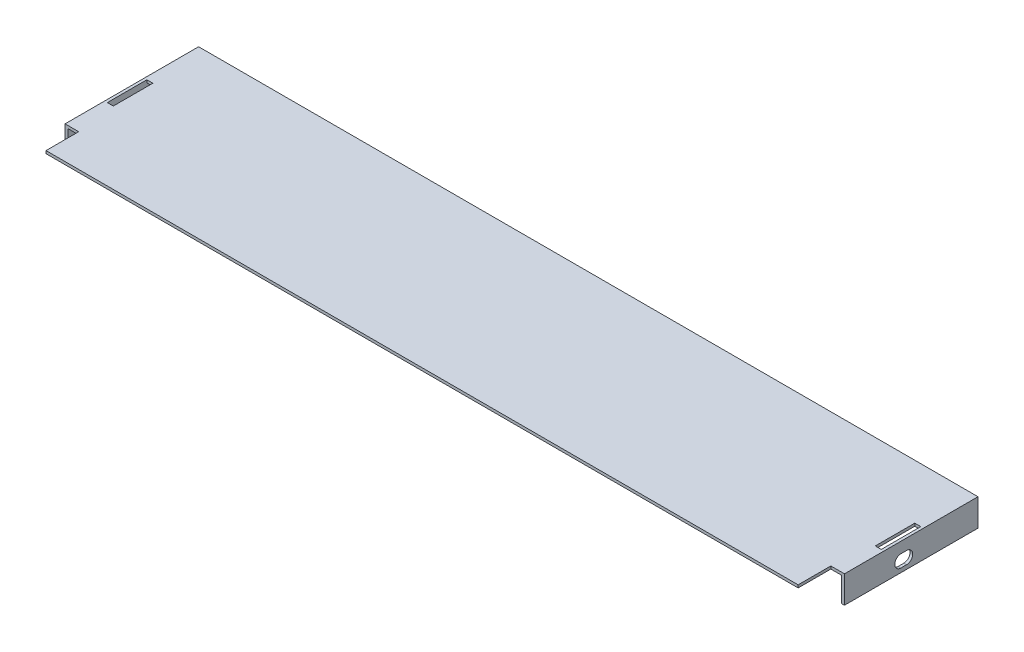
ISO-10303-21;
HEADER;
FILE_DESCRIPTION(('STEP AP214'),'2;1');
FILE_NAME('part.step','',(''),(''),'','','');
FILE_SCHEMA(('AUTOMOTIVE_DESIGN { 1 0 10303 214 1 1 1 1 }'));
ENDSEC;
DATA;
#1=APPLICATION_CONTEXT('core data for automotive mechanical design processes');
#2=APPLICATION_PROTOCOL_DEFINITION('international standard','automotive_design',2000,#1);
#3=PRODUCT_CONTEXT('',#1,'mechanical');
#4=PRODUCT('Part','Part','',(#3));
#5=PRODUCT_RELATED_PRODUCT_CATEGORY('part','',(#4));
#6=PRODUCT_DEFINITION_FORMATION('','',#4);
#7=PRODUCT_DEFINITION_CONTEXT('part definition',#1,'design');
#8=PRODUCT_DEFINITION('design','',#6,#7);
#9=PRODUCT_DEFINITION_SHAPE('','',#8);
#10=(LENGTH_UNIT() NAMED_UNIT(*) SI_UNIT(.MILLI.,.METRE.));
#11=(NAMED_UNIT(*) PLANE_ANGLE_UNIT() SI_UNIT($,.RADIAN.));
#12=(NAMED_UNIT(*) SI_UNIT($,.STERADIAN.) SOLID_ANGLE_UNIT());
#13=UNCERTAINTY_MEASURE_WITH_UNIT(LENGTH_MEASURE(1.E-05),#10,'distance_accuracy_value','');
#14=(GEOMETRIC_REPRESENTATION_CONTEXT(3) GLOBAL_UNCERTAINTY_ASSIGNED_CONTEXT((#13)) GLOBAL_UNIT_ASSIGNED_CONTEXT((#10,
#11,#12)) REPRESENTATION_CONTEXT('',''));
#15=CARTESIAN_POINT('',(0.,0.,0.));
#16=DIRECTION('',(0.,0.,1.));
#17=DIRECTION('',(1.,0.,0.));
#18=AXIS2_PLACEMENT_3D('',#15,#16,#17);
#19=CARTESIAN_POINT('',(143.,1.,18.5));
#20=DIRECTION('',(-1.,0.,0.));
#21=DIRECTION('',(0.,0.,1.));
#22=AXIS2_PLACEMENT_3D('',#19,#20,#21);
#23=PLANE('',#22);
#24=DIRECTION('',(0.,-1.,0.));
#25=VECTOR('',#24,1.);
#26=CARTESIAN_POINT('',(143.,1.,18.5));
#27=LINE('',#26,#25);
#28=CARTESIAN_POINT('',(143.,1.,18.5));
#29=VERTEX_POINT('',#28);
#30=CARTESIAN_POINT('',(143.,-9.,18.5));
#31=VERTEX_POINT('',#30);
#32=EDGE_CURVE('E393',#29,#31,#27,.T.);
#33=ORIENTED_EDGE('',*,*,#32,.T.);
#34=DIRECTION('',(0.,0.,1.));
#35=VECTOR('',#34,1.);
#36=CARTESIAN_POINT('',(143.,-9.,-30.5));
#37=LINE('',#36,#35);
#38=CARTESIAN_POINT('',(143.,-9.,-30.5));
#39=VERTEX_POINT('',#38);
#40=EDGE_CURVE('E286',#39,#31,#37,.T.);
#41=ORIENTED_EDGE('',*,*,#40,.F.);
#42=DIRECTION('',(0.,-1.,0.));
#43=VECTOR('',#42,1.);
#44=CARTESIAN_POINT('',(143.,1.,-30.5));
#45=LINE('',#44,#43);
#46=CARTESIAN_POINT('',(143.,1.,-30.5));
#47=VERTEX_POINT('',#46);
#48=EDGE_CURVE('E420',#47,#39,#45,.T.);
#49=ORIENTED_EDGE('',*,*,#48,.F.);
#50=DIRECTION('',(0.,0.,-1.));
#51=VECTOR('',#50,1.);
#52=CARTESIAN_POINT('',(143.,1.,18.5));
#53=LINE('',#52,#51);
#54=EDGE_CURVE('E375',#29,#47,#53,.T.);
#55=ORIENTED_EDGE('',*,*,#54,.F.);
#56=EDGE_LOOP('',(#33,#41,#49,#55));
#57=FACE_BOUND('',#56,.T.);
#58=CARTESIAN_POINT('',(143.,-5.25,-2.19999999999996));
#59=DIRECTION('',(-1.,0.,0.));
#60=DIRECTION('',(0.,0.,1.));
#61=AXIS2_PLACEMENT_3D('',#58,#59,#60);
#62=CIRCLE('',#61,2.25);
#63=CARTESIAN_POINT('',(143.,-7.5,-2.19999999999996));
#64=VERTEX_POINT('',#63);
#65=CARTESIAN_POINT('',(143.,-3.,-2.19999999999996));
#66=VERTEX_POINT('',#65);
#67=EDGE_CURVE('E49',#64,#66,#62,.T.);
#68=ORIENTED_EDGE('',*,*,#67,.T.);
#69=DIRECTION('',(0.,0.,-1.));
#70=VECTOR('',#69,1.);
#71=CARTESIAN_POINT('',(143.,-3.,-2.19999999999996));
#72=LINE('',#71,#70);
#73=CARTESIAN_POINT('',(143.,-3.,-4.29999999999996));
#74=VERTEX_POINT('',#73);
#75=EDGE_CURVE('E251',#66,#74,#72,.T.);
#76=ORIENTED_EDGE('',*,*,#75,.T.);
#77=CARTESIAN_POINT('',(143.,-5.25,-4.29999999999996));
#78=DIRECTION('',(-1.,0.,0.));
#79=DIRECTION('',(0.,0.,1.));
#80=AXIS2_PLACEMENT_3D('',#77,#78,#79);
#81=CIRCLE('',#80,2.25);
#82=CARTESIAN_POINT('',(143.,-7.5,-4.29999999999996));
#83=VERTEX_POINT('',#82);
#84=EDGE_CURVE('E254',#74,#83,#81,.T.);
#85=ORIENTED_EDGE('',*,*,#84,.T.);
#86=DIRECTION('',(0.,0.,-1.));
#87=VECTOR('',#86,1.);
#88=CARTESIAN_POINT('',(143.,-7.5,-2.19999999999996));
#89=LINE('',#88,#87);
#90=EDGE_CURVE('E231',#64,#83,#89,.T.);
#91=ORIENTED_EDGE('',*,*,#90,.F.);
#92=EDGE_LOOP('',(#68,#76,#85,#91));
#93=FACE_BOUND('',#92,.T.);
#94=ADVANCED_FACE('F35',(#57,#93),#23,.F.);
#95=CARTESIAN_POINT('',(-143.,1.,18.5));
#96=DIRECTION('',(1.,0.,0.));
#97=DIRECTION('',(0.,0.,-1.));
#98=AXIS2_PLACEMENT_3D('',#95,#96,#97);
#99=PLANE('',#98);
#100=DIRECTION('',(0.,-1.,0.));
#101=VECTOR('',#100,1.);
#102=CARTESIAN_POINT('',(-143.,1.,-30.5));
#103=LINE('',#102,#101);
#104=CARTESIAN_POINT('',(-143.,1.,-30.5));
#105=VERTEX_POINT('',#104);
#106=CARTESIAN_POINT('',(-143.,-9.,-30.5));
#107=VERTEX_POINT('',#106);
#108=EDGE_CURVE('E418',#105,#107,#103,.T.);
#109=ORIENTED_EDGE('',*,*,#108,.T.);
#110=DIRECTION('',(0.,0.,-1.));
#111=VECTOR('',#110,1.);
#112=CARTESIAN_POINT('',(-143.,-9.,18.5));
#113=LINE('',#112,#111);
#114=CARTESIAN_POINT('',(-143.,-9.,18.5));
#115=VERTEX_POINT('',#114);
#116=EDGE_CURVE('E279',#115,#107,#113,.T.);
#117=ORIENTED_EDGE('',*,*,#116,.F.);
#118=DIRECTION('',(0.,-1.,0.));
#119=VECTOR('',#118,1.);
#120=CARTESIAN_POINT('',(-143.,1.,18.5));
#121=LINE('',#120,#119);
#122=CARTESIAN_POINT('',(-143.,1.,18.5));
#123=VERTEX_POINT('',#122);
#124=EDGE_CURVE('E416',#123,#115,#121,.T.);
#125=ORIENTED_EDGE('',*,*,#124,.F.);
#126=DIRECTION('',(0.,0.,1.));
#127=VECTOR('',#126,1.);
#128=CARTESIAN_POINT('',(-143.,1.,18.5));
#129=LINE('',#128,#127);
#130=EDGE_CURVE('E381',#105,#123,#129,.T.);
#131=ORIENTED_EDGE('',*,*,#130,.F.);
#132=EDGE_LOOP('',(#109,#117,#125,#131));
#133=FACE_BOUND('',#132,.T.);
#134=CARTESIAN_POINT('',(-143.,-5.25,-2.19999999999996));
#135=DIRECTION('',(-1.,0.,0.));
#136=DIRECTION('',(0.,0.,1.));
#137=AXIS2_PLACEMENT_3D('',#134,#135,#136);
#138=CIRCLE('',#137,2.25);
#139=CARTESIAN_POINT('',(-143.,-7.5,-2.19999999999996));
#140=VERTEX_POINT('',#139);
#141=CARTESIAN_POINT('',(-143.,-3.,-2.19999999999996));
#142=VERTEX_POINT('',#141);
#143=EDGE_CURVE('E221',#140,#142,#138,.T.);
#144=ORIENTED_EDGE('',*,*,#143,.F.);
#145=DIRECTION('',(0.,0.,-1.));
#146=VECTOR('',#145,1.);
#147=CARTESIAN_POINT('',(-143.,-7.5,-2.19999999999996));
#148=LINE('',#147,#146);
#149=CARTESIAN_POINT('',(-143.,-7.5,-4.29999999999996));
#150=VERTEX_POINT('',#149);
#151=EDGE_CURVE('E245',#140,#150,#148,.T.);
#152=ORIENTED_EDGE('',*,*,#151,.T.);
#153=CARTESIAN_POINT('',(-143.,-5.25,-4.29999999999996));
#154=DIRECTION('',(-1.,0.,0.));
#155=DIRECTION('',(0.,0.,1.));
#156=AXIS2_PLACEMENT_3D('',#153,#154,#155);
#157=CIRCLE('',#156,2.25);
#158=CARTESIAN_POINT('',(-143.,-3.,-4.29999999999996));
#159=VERTEX_POINT('',#158);
#160=EDGE_CURVE('E243',#159,#150,#157,.T.);
#161=ORIENTED_EDGE('',*,*,#160,.F.);
#162=DIRECTION('',(0.,0.,-1.));
#163=VECTOR('',#162,1.);
#164=CARTESIAN_POINT('',(-143.,-3.,-2.19999999999996));
#165=LINE('',#164,#163);
#166=EDGE_CURVE('E230',#142,#159,#165,.T.);
#167=ORIENTED_EDGE('',*,*,#166,.F.);
#168=EDGE_LOOP('',(#144,#152,#161,#167));
#169=FACE_BOUND('',#168,.T.);
#170=ADVANCED_FACE('F242',(#133,#169),#99,.F.);
#171=CARTESIAN_POINT('',(142.,1.,-10.5));
#172=DIRECTION('',(-1.,0.,0.));
#173=DIRECTION('',(0.,0.,1.));
#174=AXIS2_PLACEMENT_3D('',#171,#172,#173);
#175=PLANE('',#174);
#176=DIRECTION('',(0.,-1.,0.));
#177=VECTOR('',#176,1.);
#178=CARTESIAN_POINT('',(142.,1.,-10.5));
#179=LINE('',#178,#177);
#180=CARTESIAN_POINT('',(142.,1.,-10.5));
#181=VERTEX_POINT('',#180);
#182=CARTESIAN_POINT('',(142.,0.,-10.5));
#183=VERTEX_POINT('',#182);
#184=EDGE_CURVE('E371',#181,#183,#179,.T.);
#185=ORIENTED_EDGE('',*,*,#184,.T.);
#186=DIRECTION('',(0.,0.,-1.));
#187=VECTOR('',#186,1.);
#188=CARTESIAN_POINT('',(142.,0.,18.5));
#189=LINE('',#188,#187);
#190=CARTESIAN_POINT('',(142.,0.,-29.5));
#191=VERTEX_POINT('',#190);
#192=EDGE_CURVE('E301',#183,#191,#189,.T.);
#193=ORIENTED_EDGE('',*,*,#192,.T.);
#194=DIRECTION('',(0.,1.,0.));
#195=VECTOR('',#194,1.);
#196=CARTESIAN_POINT('',(142.,-9.,-29.5));
#197=LINE('',#196,#195);
#198=CARTESIAN_POINT('',(142.,-9.,-29.5));
#199=VERTEX_POINT('',#198);
#200=EDGE_CURVE('E312',#199,#191,#197,.T.);
#201=ORIENTED_EDGE('',*,*,#200,.F.);
#202=DIRECTION('',(0.,0.,-1.));
#203=VECTOR('',#202,1.);
#204=CARTESIAN_POINT('',(142.,-9.,18.5));
#205=LINE('',#204,#203);
#206=CARTESIAN_POINT('',(142.,-9.,18.5));
#207=VERTEX_POINT('',#206);
#208=EDGE_CURVE('E291',#207,#199,#205,.T.);
#209=ORIENTED_EDGE('',*,*,#208,.F.);
#210=DIRECTION('',(0.,1.,0.));
#211=VECTOR('',#210,1.);
#212=CARTESIAN_POINT('',(142.,-9.,18.5));
#213=LINE('',#212,#211);
#214=CARTESIAN_POINT('',(142.,0.,18.5));
#215=VERTEX_POINT('',#214);
#216=EDGE_CURVE('E315',#207,#215,#213,.T.);
#217=ORIENTED_EDGE('',*,*,#216,.T.);
#218=CARTESIAN_POINT('',(142.,0.,4.00000000000004));
#219=VERTEX_POINT('',#218);
#220=EDGE_CURVE('E275',#215,#219,#189,.T.);
#221=ORIENTED_EDGE('',*,*,#220,.T.);
#222=DIRECTION('',(0.,-1.,0.));
#223=VECTOR('',#222,1.);
#224=CARTESIAN_POINT('',(142.,1.,4.00000000000004));
#225=LINE('',#224,#223);
#226=CARTESIAN_POINT('',(142.,1.,4.00000000000004));
#227=VERTEX_POINT('',#226);
#228=EDGE_CURVE('E358',#227,#219,#225,.T.);
#229=ORIENTED_EDGE('',*,*,#228,.F.);
#230=DIRECTION('',(0.,0.,-1.));
#231=VECTOR('',#230,1.);
#232=CARTESIAN_POINT('',(142.,1.,-10.5));
#233=LINE('',#232,#231);
#234=EDGE_CURVE('E348',#227,#181,#233,.T.);
#235=ORIENTED_EDGE('',*,*,#234,.T.);
#236=EDGE_LOOP('',(#185,#193,#201,#209,#217,#221,#229,#235));
#237=FACE_BOUND('',#236,.T.);
#238=DIRECTION('',(0.,0.,1.));
#239=VECTOR('',#238,1.);
#240=CARTESIAN_POINT('',(142.,-3.,-10.5));
#241=LINE('',#240,#239);
#242=CARTESIAN_POINT('',(142.,-3.,-4.29999999999996));
#243=VERTEX_POINT('',#242);
#244=CARTESIAN_POINT('',(142.,-3.,-2.19999999999996));
#245=VERTEX_POINT('',#244);
#246=EDGE_CURVE('E269',#243,#245,#241,.T.);
#247=ORIENTED_EDGE('',*,*,#246,.T.);
#248=CARTESIAN_POINT('',(142.,-5.25,-2.19999999999996));
#249=DIRECTION('',(-1.,0.,0.));
#250=DIRECTION('',(0.,0.,1.));
#251=AXIS2_PLACEMENT_3D('',#248,#249,#250);
#252=CIRCLE('',#251,2.25);
#253=CARTESIAN_POINT('',(142.,-7.5,-2.19999999999996));
#254=VERTEX_POINT('',#253);
#255=EDGE_CURVE('E272',#245,#254,#252,.F.);
#256=ORIENTED_EDGE('',*,*,#255,.T.);
#257=DIRECTION('',(0.,0.,1.));
#258=VECTOR('',#257,1.);
#259=CARTESIAN_POINT('',(142.,-7.5,-10.5));
#260=LINE('',#259,#258);
#261=CARTESIAN_POINT('',(142.,-7.5,-4.29999999999996));
#262=VERTEX_POINT('',#261);
#263=EDGE_CURVE('E238',#262,#254,#260,.T.);
#264=ORIENTED_EDGE('',*,*,#263,.F.);
#265=CARTESIAN_POINT('',(142.,-5.25,-4.29999999999996));
#266=DIRECTION('',(-1.,0.,0.));
#267=DIRECTION('',(0.,0.,1.));
#268=AXIS2_PLACEMENT_3D('',#265,#266,#267);
#269=CIRCLE('',#268,2.25);
#270=EDGE_CURVE('E266',#262,#243,#269,.F.);
#271=ORIENTED_EDGE('',*,*,#270,.T.);
#272=EDGE_LOOP('',(#247,#256,#264,#271));
#273=FACE_BOUND('',#272,.T.);
#274=ADVANCED_FACE('F451',(#237,#273),#175,.T.);
#275=CARTESIAN_POINT('',(-142.,1.,-10.4999999999999));
#276=DIRECTION('',(1.,0.,0.));
#277=DIRECTION('',(0.,0.,-1.));
#278=AXIS2_PLACEMENT_3D('',#275,#276,#277);
#279=PLANE('',#278);
#280=DIRECTION('',(0.,-1.,0.));
#281=VECTOR('',#280,1.);
#282=CARTESIAN_POINT('',(-142.,1.,4.00000000000007));
#283=LINE('',#282,#281);
#284=CARTESIAN_POINT('',(-142.,1.,4.00000000000007));
#285=VERTEX_POINT('',#284);
#286=CARTESIAN_POINT('',(-142.,0.,4.00000000000007));
#287=VERTEX_POINT('',#286);
#288=EDGE_CURVE('E339',#285,#287,#283,.T.);
#289=ORIENTED_EDGE('',*,*,#288,.T.);
#290=DIRECTION('',(0.,0.,1.));
#291=VECTOR('',#290,1.);
#292=CARTESIAN_POINT('',(-142.,0.,-29.5));
#293=LINE('',#292,#291);
#294=CARTESIAN_POINT('',(-142.,0.,18.5));
#295=VERTEX_POINT('',#294);
#296=EDGE_CURVE('E306',#287,#295,#293,.T.);
#297=ORIENTED_EDGE('',*,*,#296,.T.);
#298=DIRECTION('',(0.,1.,0.));
#299=VECTOR('',#298,1.);
#300=CARTESIAN_POINT('',(-142.,-9.,18.5));
#301=LINE('',#300,#299);
#302=CARTESIAN_POINT('',(-142.,-9.,18.5));
#303=VERTEX_POINT('',#302);
#304=EDGE_CURVE('E297',#303,#295,#301,.T.);
#305=ORIENTED_EDGE('',*,*,#304,.F.);
#306=DIRECTION('',(0.,0.,1.));
#307=VECTOR('',#306,1.);
#308=CARTESIAN_POINT('',(-142.,-9.,-29.5));
#309=LINE('',#308,#307);
#310=CARTESIAN_POINT('',(-142.,-9.,-29.5));
#311=VERTEX_POINT('',#310);
#312=EDGE_CURVE('E295',#311,#303,#309,.T.);
#313=ORIENTED_EDGE('',*,*,#312,.F.);
#314=DIRECTION('',(0.,1.,0.));
#315=VECTOR('',#314,1.);
#316=CARTESIAN_POINT('',(-142.,-9.,-29.5));
#317=LINE('',#316,#315);
#318=CARTESIAN_POINT('',(-142.,0.,-29.5));
#319=VERTEX_POINT('',#318);
#320=EDGE_CURVE('E309',#311,#319,#317,.T.);
#321=ORIENTED_EDGE('',*,*,#320,.T.);
#322=CARTESIAN_POINT('',(-142.,0.,-10.4999999999999));
#323=VERTEX_POINT('',#322);
#324=EDGE_CURVE('E280',#319,#323,#293,.T.);
#325=ORIENTED_EDGE('',*,*,#324,.T.);
#326=DIRECTION('',(0.,-1.,0.));
#327=VECTOR('',#326,1.);
#328=CARTESIAN_POINT('',(-142.,1.,-10.4999999999999));
#329=LINE('',#328,#327);
#330=CARTESIAN_POINT('',(-142.,1.,-10.4999999999999));
#331=VERTEX_POINT('',#330);
#332=EDGE_CURVE('E342',#331,#323,#329,.T.);
#333=ORIENTED_EDGE('',*,*,#332,.F.);
#334=DIRECTION('',(0.,0.,1.));
#335=VECTOR('',#334,1.);
#336=CARTESIAN_POINT('',(-142.,1.,-10.4999999999999));
#337=LINE('',#336,#335);
#338=EDGE_CURVE('E324',#331,#285,#337,.T.);
#339=ORIENTED_EDGE('',*,*,#338,.T.);
#340=EDGE_LOOP('',(#289,#297,#305,#313,#321,#325,#333,#339));
#341=FACE_BOUND('',#340,.T.);
#342=DIRECTION('',(0.,0.,-1.));
#343=VECTOR('',#342,1.);
#344=CARTESIAN_POINT('',(-142.,-7.5,-10.4999999999999));
#345=LINE('',#344,#343);
#346=CARTESIAN_POINT('',(-142.,-7.5,-2.19999999999996));
#347=VERTEX_POINT('',#346);
#348=CARTESIAN_POINT('',(-142.,-7.5,-4.29999999999996));
#349=VERTEX_POINT('',#348);
#350=EDGE_CURVE('E422',#347,#349,#345,.T.);
#351=ORIENTED_EDGE('',*,*,#350,.F.);
#352=CARTESIAN_POINT('',(-142.,-5.25,-2.19999999999996));
#353=DIRECTION('',(1.,0.,0.));
#354=DIRECTION('',(0.,0.,-1.));
#355=AXIS2_PLACEMENT_3D('',#352,#353,#354);
#356=CIRCLE('',#355,2.25);
#357=CARTESIAN_POINT('',(-142.,-3.,-2.19999999999996));
#358=VERTEX_POINT('',#357);
#359=EDGE_CURVE('E11',#347,#358,#356,.F.);
#360=ORIENTED_EDGE('',*,*,#359,.T.);
#361=DIRECTION('',(0.,0.,-1.));
#362=VECTOR('',#361,1.);
#363=CARTESIAN_POINT('',(-142.,-3.,-10.4999999999999));
#364=LINE('',#363,#362);
#365=CARTESIAN_POINT('',(-142.,-3.,-4.29999999999996));
#366=VERTEX_POINT('',#365);
#367=EDGE_CURVE('E42',#358,#366,#364,.T.);
#368=ORIENTED_EDGE('',*,*,#367,.T.);
#369=CARTESIAN_POINT('',(-142.,-5.25,-4.29999999999996));
#370=DIRECTION('',(1.,0.,0.));
#371=DIRECTION('',(0.,0.,-1.));
#372=AXIS2_PLACEMENT_3D('',#369,#370,#371);
#373=CIRCLE('',#372,2.25);
#374=EDGE_CURVE('E424',#366,#349,#373,.F.);
#375=ORIENTED_EDGE('',*,*,#374,.T.);
#376=EDGE_LOOP('',(#351,#360,#368,#375));
#377=FACE_BOUND('',#376,.T.);
#378=ADVANCED_FACE('F428',(#341,#377),#279,.T.);
#379=CARTESIAN_POINT('',(0.,1.,0.));
#380=DIRECTION('',(0.,-1.,0.));
#381=DIRECTION('',(0.,0.,-1.));
#382=AXIS2_PLACEMENT_3D('',#379,#380,#381);
#383=PLANE('',#382);
#384=ORIENTED_EDGE('',*,*,#234,.F.);
#385=DIRECTION('',(1.,0.,0.));
#386=VECTOR('',#385,1.);
#387=CARTESIAN_POINT('',(139.8,1.,4.00000000000004));
#388=LINE('',#387,#386);
#389=CARTESIAN_POINT('',(139.8,1.,4.00000000000004));
#390=VERTEX_POINT('',#389);
#391=EDGE_CURVE('E356',#390,#227,#388,.T.);
#392=ORIENTED_EDGE('',*,*,#391,.F.);
#393=DIRECTION('',(0.,0.,1.));
#394=VECTOR('',#393,1.);
#395=CARTESIAN_POINT('',(139.8,1.,-10.5));
#396=LINE('',#395,#394);
#397=CARTESIAN_POINT('',(139.8,1.,-10.5));
#398=VERTEX_POINT('',#397);
#399=EDGE_CURVE('E353',#398,#390,#396,.T.);
#400=ORIENTED_EDGE('',*,*,#399,.F.);
#401=DIRECTION('',(-1.,0.,0.));
#402=VECTOR('',#401,1.);
#403=CARTESIAN_POINT('',(139.8,1.,-10.5));
#404=LINE('',#403,#402);
#405=EDGE_CURVE('E350',#181,#398,#404,.T.);
#406=ORIENTED_EDGE('',*,*,#405,.F.);
#407=EDGE_LOOP('',(#384,#392,#400,#406));
#408=FACE_BOUND('',#407,.T.);
#409=ORIENTED_EDGE('',*,*,#54,.T.);
#410=DIRECTION('',(-1.,0.,0.));
#411=VECTOR('',#410,1.);
#412=CARTESIAN_POINT('',(-143.,1.,-30.5));
#413=LINE('',#412,#411);
#414=EDGE_CURVE('E378',#47,#105,#413,.T.);
#415=ORIENTED_EDGE('',*,*,#414,.T.);
#416=ORIENTED_EDGE('',*,*,#130,.T.);
#417=DIRECTION('',(1.,0.,0.));
#418=VECTOR('',#417,1.);
#419=CARTESIAN_POINT('',(-138.,1.,18.5));
#420=LINE('',#419,#418);
#421=CARTESIAN_POINT('',(-138.,1.,18.5));
#422=VERTEX_POINT('',#421);
#423=EDGE_CURVE('E383',#123,#422,#420,.T.);
#424=ORIENTED_EDGE('',*,*,#423,.T.);
#425=DIRECTION('',(0.,0.,1.));
#426=VECTOR('',#425,1.);
#427=CARTESIAN_POINT('',(-138.,1.,30.5));
#428=LINE('',#427,#426);
#429=CARTESIAN_POINT('',(-138.,1.,30.5));
#430=VERTEX_POINT('',#429);
#431=EDGE_CURVE('E385',#422,#430,#428,.T.);
#432=ORIENTED_EDGE('',*,*,#431,.T.);
#433=DIRECTION('',(1.,0.,0.));
#434=VECTOR('',#433,1.);
#435=CARTESIAN_POINT('',(-138.,1.,30.5));
#436=LINE('',#435,#434);
#437=CARTESIAN_POINT('',(138.,1.,30.5));
#438=VERTEX_POINT('',#437);
#439=EDGE_CURVE('E387',#430,#438,#436,.T.);
#440=ORIENTED_EDGE('',*,*,#439,.T.);
#441=DIRECTION('',(0.,0.,-1.));
#442=VECTOR('',#441,1.);
#443=CARTESIAN_POINT('',(138.,1.,30.5));
#444=LINE('',#443,#442);
#445=CARTESIAN_POINT('',(138.,1.,18.5));
#446=VERTEX_POINT('',#445);
#447=EDGE_CURVE('E389',#438,#446,#444,.T.);
#448=ORIENTED_EDGE('',*,*,#447,.T.);
#449=DIRECTION('',(1.,0.,0.));
#450=VECTOR('',#449,1.);
#451=CARTESIAN_POINT('',(138.,1.,18.5));
#452=LINE('',#451,#450);
#453=EDGE_CURVE('E391',#446,#29,#452,.T.);
#454=ORIENTED_EDGE('',*,*,#453,.T.);
#455=EDGE_LOOP('',(#409,#415,#416,#424,#432,#440,#448,#454));
#456=FACE_BOUND('',#455,.T.);
#457=DIRECTION('',(0.,0.,-1.));
#458=VECTOR('',#457,1.);
#459=CARTESIAN_POINT('',(-139.8,1.,-10.4999999999999));
#460=LINE('',#459,#458);
#461=CARTESIAN_POINT('',(-139.8,1.,4.00000000000007));
#462=VERTEX_POINT('',#461);
#463=CARTESIAN_POINT('',(-139.8,1.,-10.4999999999999));
#464=VERTEX_POINT('',#463);
#465=EDGE_CURVE('E319',#462,#464,#460,.T.);
#466=ORIENTED_EDGE('',*,*,#465,.F.);
#467=DIRECTION('',(1.,0.,0.));
#468=VECTOR('',#467,1.);
#469=CARTESIAN_POINT('',(-139.8,1.,4.00000000000007));
#470=LINE('',#469,#468);
#471=EDGE_CURVE('E327',#285,#462,#470,.T.);
#472=ORIENTED_EDGE('',*,*,#471,.F.);
#473=ORIENTED_EDGE('',*,*,#338,.F.);
#474=DIRECTION('',(-1.,0.,0.));
#475=VECTOR('',#474,1.);
#476=CARTESIAN_POINT('',(-139.8,1.,-10.4999999999999));
#477=LINE('',#476,#475);
#478=EDGE_CURVE('E321',#464,#331,#477,.T.);
#479=ORIENTED_EDGE('',*,*,#478,.F.);
#480=EDGE_LOOP('',(#466,#472,#473,#479));
#481=FACE_BOUND('',#480,.T.);
#482=ADVANCED_FACE('F490',(#408,#456,#481),#383,.F.);
#483=CARTESIAN_POINT('',(0.,0.,0.));
#484=DIRECTION('',(0.,-1.,0.));
#485=DIRECTION('',(0.,0.,-1.));
#486=AXIS2_PLACEMENT_3D('',#483,#484,#485);
#487=PLANE('',#486);
#488=ORIENTED_EDGE('',*,*,#296,.F.);
#489=DIRECTION('',(1.,0.,0.));
#490=VECTOR('',#489,1.);
#491=CARTESIAN_POINT('',(-139.8,0.,4.00000000000007));
#492=LINE('',#491,#490);
#493=CARTESIAN_POINT('',(-139.8,0.,4.00000000000007));
#494=VERTEX_POINT('',#493);
#495=EDGE_CURVE('E322',#287,#494,#492,.T.);
#496=ORIENTED_EDGE('',*,*,#495,.T.);
#497=DIRECTION('',(0.,0.,-1.));
#498=VECTOR('',#497,1.);
#499=CARTESIAN_POINT('',(-139.8,0.,-10.4999999999999));
#500=LINE('',#499,#498);
#501=CARTESIAN_POINT('',(-139.8,0.,-10.4999999999999));
#502=VERTEX_POINT('',#501);
#503=EDGE_CURVE('E318',#494,#502,#500,.T.);
#504=ORIENTED_EDGE('',*,*,#503,.T.);
#505=DIRECTION('',(-1.,0.,0.));
#506=VECTOR('',#505,1.);
#507=CARTESIAN_POINT('',(-139.8,0.,-10.4999999999999));
#508=LINE('',#507,#506);
#509=EDGE_CURVE('E332',#502,#323,#508,.T.);
#510=ORIENTED_EDGE('',*,*,#509,.T.);
#511=ORIENTED_EDGE('',*,*,#324,.F.);
#512=DIRECTION('',(-1.,0.,0.));
#513=VECTOR('',#512,1.);
#514=CARTESIAN_POINT('',(142.,0.,-29.5));
#515=LINE('',#514,#513);
#516=EDGE_CURVE('E300',#191,#319,#515,.T.);
#517=ORIENTED_EDGE('',*,*,#516,.F.);
#518=ORIENTED_EDGE('',*,*,#192,.F.);
#519=DIRECTION('',(-1.,0.,0.));
#520=VECTOR('',#519,1.);
#521=CARTESIAN_POINT('',(139.8,0.,-10.5));
#522=LINE('',#521,#520);
#523=CARTESIAN_POINT('',(139.8,0.,-10.5));
#524=VERTEX_POINT('',#523);
#525=EDGE_CURVE('E347',#183,#524,#522,.T.);
#526=ORIENTED_EDGE('',*,*,#525,.T.);
#527=DIRECTION('',(0.,0.,1.));
#528=VECTOR('',#527,1.);
#529=CARTESIAN_POINT('',(139.8,0.,-10.5));
#530=LINE('',#529,#528);
#531=CARTESIAN_POINT('',(139.8,0.,4.00000000000004));
#532=VERTEX_POINT('',#531);
#533=EDGE_CURVE('E361',#524,#532,#530,.T.);
#534=ORIENTED_EDGE('',*,*,#533,.T.);
#535=DIRECTION('',(1.,0.,0.));
#536=VECTOR('',#535,1.);
#537=CARTESIAN_POINT('',(139.8,0.,4.00000000000004));
#538=LINE('',#537,#536);
#539=EDGE_CURVE('E351',#532,#219,#538,.T.);
#540=ORIENTED_EDGE('',*,*,#539,.T.);
#541=ORIENTED_EDGE('',*,*,#220,.F.);
#542=DIRECTION('',(1.,0.,0.));
#543=VECTOR('',#542,1.);
#544=CARTESIAN_POINT('',(138.,0.,18.5));
#545=LINE('',#544,#543);
#546=CARTESIAN_POINT('',(138.,0.,18.5));
#547=VERTEX_POINT('',#546);
#548=EDGE_CURVE('E379',#547,#215,#545,.T.);
#549=ORIENTED_EDGE('',*,*,#548,.F.);
#550=DIRECTION('',(0.,0.,-1.));
#551=VECTOR('',#550,1.);
#552=CARTESIAN_POINT('',(138.,0.,30.5));
#553=LINE('',#552,#551);
#554=CARTESIAN_POINT('',(138.,0.,30.5));
#555=VERTEX_POINT('',#554);
#556=EDGE_CURVE('E399',#555,#547,#553,.T.);
#557=ORIENTED_EDGE('',*,*,#556,.F.);
#558=DIRECTION('',(1.,0.,0.));
#559=VECTOR('',#558,1.);
#560=CARTESIAN_POINT('',(-138.,0.,30.5));
#561=LINE('',#560,#559);
#562=CARTESIAN_POINT('',(-138.,0.,30.5));
#563=VERTEX_POINT('',#562);
#564=EDGE_CURVE('E397',#563,#555,#561,.T.);
#565=ORIENTED_EDGE('',*,*,#564,.F.);
#566=DIRECTION('',(0.,0.,1.));
#567=VECTOR('',#566,1.);
#568=CARTESIAN_POINT('',(-138.,0.,30.5));
#569=LINE('',#568,#567);
#570=CARTESIAN_POINT('',(-138.,0.,18.5));
#571=VERTEX_POINT('',#570);
#572=EDGE_CURVE('E395',#571,#563,#569,.T.);
#573=ORIENTED_EDGE('',*,*,#572,.F.);
#574=DIRECTION('',(1.,0.,0.));
#575=VECTOR('',#574,1.);
#576=CARTESIAN_POINT('',(-138.,0.,18.5));
#577=LINE('',#576,#575);
#578=EDGE_CURVE('E374',#295,#571,#577,.T.);
#579=ORIENTED_EDGE('',*,*,#578,.F.);
#580=EDGE_LOOP('',(#488,#496,#504,#510,#511,#517,#518,#526,#534,#540,#541,#549,#557,#565,#573,#579));
#581=FACE_BOUND('',#580,.T.);
#582=ADVANCED_FACE('F517',(#581),#487,.T.);
#583=CARTESIAN_POINT('',(-143.,1.,-30.5));
#584=DIRECTION('',(0.,0.,1.));
#585=DIRECTION('',(1.,0.,0.));
#586=AXIS2_PLACEMENT_3D('',#583,#584,#585);
#587=PLANE('',#586);
#588=ORIENTED_EDGE('',*,*,#48,.T.);
#589=DIRECTION('',(1.,0.,0.));
#590=VECTOR('',#589,1.);
#591=CARTESIAN_POINT('',(-143.,-9.,-30.5));
#592=LINE('',#591,#590);
#593=EDGE_CURVE('E283',#107,#39,#592,.T.);
#594=ORIENTED_EDGE('',*,*,#593,.F.);
#595=ORIENTED_EDGE('',*,*,#108,.F.);
#596=ORIENTED_EDGE('',*,*,#414,.F.);
#597=EDGE_LOOP('',(#588,#594,#595,#596));
#598=FACE_BOUND('',#597,.T.);
#599=ADVANCED_FACE('F521',(#598),#587,.F.);
#600=CARTESIAN_POINT('',(-138.,1.,18.5));
#601=DIRECTION('',(0.,0.,-1.));
#602=DIRECTION('',(-1.,0.,0.));
#603=AXIS2_PLACEMENT_3D('',#600,#601,#602);
#604=PLANE('',#603);
#605=ORIENTED_EDGE('',*,*,#124,.T.);
#606=DIRECTION('',(-1.,0.,0.));
#607=VECTOR('',#606,1.);
#608=CARTESIAN_POINT('',(-142.,-9.,18.5));
#609=LINE('',#608,#607);
#610=EDGE_CURVE('E276',#303,#115,#609,.T.);
#611=ORIENTED_EDGE('',*,*,#610,.F.);
#612=ORIENTED_EDGE('',*,*,#304,.T.);
#613=ORIENTED_EDGE('',*,*,#578,.T.);
#614=DIRECTION('',(0.,-1.,0.));
#615=VECTOR('',#614,1.);
#616=CARTESIAN_POINT('',(-138.,1.,18.5));
#617=LINE('',#616,#615);
#618=EDGE_CURVE('E413',#422,#571,#617,.T.);
#619=ORIENTED_EDGE('',*,*,#618,.F.);
#620=ORIENTED_EDGE('',*,*,#423,.F.);
#621=EDGE_LOOP('',(#605,#611,#612,#613,#619,#620));
#622=FACE_BOUND('',#621,.T.);
#623=ADVANCED_FACE('F537',(#622),#604,.F.);
#624=CARTESIAN_POINT('',(-138.,1.,30.5));
#625=DIRECTION('',(1.,0.,0.));
#626=DIRECTION('',(0.,0.,-1.));
#627=AXIS2_PLACEMENT_3D('',#624,#625,#626);
#628=PLANE('',#627);
#629=ORIENTED_EDGE('',*,*,#572,.T.);
#630=DIRECTION('',(0.,-1.,0.));
#631=VECTOR('',#630,1.);
#632=CARTESIAN_POINT('',(-138.,1.,30.5));
#633=LINE('',#632,#631);
#634=EDGE_CURVE('E410',#430,#563,#633,.T.);
#635=ORIENTED_EDGE('',*,*,#634,.F.);
#636=ORIENTED_EDGE('',*,*,#431,.F.);
#637=ORIENTED_EDGE('',*,*,#618,.T.);
#638=EDGE_LOOP('',(#629,#635,#636,#637));
#639=FACE_BOUND('',#638,.T.);
#640=ADVANCED_FACE('F533',(#639),#628,.F.);
#641=CARTESIAN_POINT('',(-138.,1.,30.5));
#642=DIRECTION('',(0.,0.,-1.));
#643=DIRECTION('',(-1.,0.,0.));
#644=AXIS2_PLACEMENT_3D('',#641,#642,#643);
#645=PLANE('',#644);
#646=ORIENTED_EDGE('',*,*,#564,.T.);
#647=DIRECTION('',(0.,-1.,0.));
#648=VECTOR('',#647,1.);
#649=CARTESIAN_POINT('',(138.,1.,30.5));
#650=LINE('',#649,#648);
#651=EDGE_CURVE('E407',#438,#555,#650,.T.);
#652=ORIENTED_EDGE('',*,*,#651,.F.);
#653=ORIENTED_EDGE('',*,*,#439,.F.);
#654=ORIENTED_EDGE('',*,*,#634,.T.);
#655=EDGE_LOOP('',(#646,#652,#653,#654));
#656=FACE_BOUND('',#655,.T.);
#657=ADVANCED_FACE('F529',(#656),#645,.F.);
#658=CARTESIAN_POINT('',(138.,1.,30.5));
#659=DIRECTION('',(-1.,0.,0.));
#660=DIRECTION('',(0.,0.,1.));
#661=AXIS2_PLACEMENT_3D('',#658,#659,#660);
#662=PLANE('',#661);
#663=ORIENTED_EDGE('',*,*,#556,.T.);
#664=DIRECTION('',(0.,-1.,0.));
#665=VECTOR('',#664,1.);
#666=CARTESIAN_POINT('',(138.,1.,18.5));
#667=LINE('',#666,#665);
#668=EDGE_CURVE('E404',#446,#547,#667,.T.);
#669=ORIENTED_EDGE('',*,*,#668,.F.);
#670=ORIENTED_EDGE('',*,*,#447,.F.);
#671=ORIENTED_EDGE('',*,*,#651,.T.);
#672=EDGE_LOOP('',(#663,#669,#670,#671));
#673=FACE_BOUND('',#672,.T.);
#674=ADVANCED_FACE('F525',(#673),#662,.F.);
#675=CARTESIAN_POINT('',(138.,1.,18.5));
#676=DIRECTION('',(0.,0.,-1.));
#677=DIRECTION('',(-1.,0.,0.));
#678=AXIS2_PLACEMENT_3D('',#675,#676,#677);
#679=PLANE('',#678);
#680=ORIENTED_EDGE('',*,*,#548,.T.);
#681=ORIENTED_EDGE('',*,*,#216,.F.);
#682=DIRECTION('',(-1.,0.,0.));
#683=VECTOR('',#682,1.);
#684=CARTESIAN_POINT('',(143.,-9.,18.5));
#685=LINE('',#684,#683);
#686=EDGE_CURVE('E289',#31,#207,#685,.T.);
#687=ORIENTED_EDGE('',*,*,#686,.F.);
#688=ORIENTED_EDGE('',*,*,#32,.F.);
#689=ORIENTED_EDGE('',*,*,#453,.F.);
#690=ORIENTED_EDGE('',*,*,#668,.T.);
#691=EDGE_LOOP('',(#680,#681,#687,#688,#689,#690));
#692=FACE_BOUND('',#691,.T.);
#693=ADVANCED_FACE('F510',(#692),#679,.F.);
#694=CARTESIAN_POINT('',(139.8,1.,-10.5));
#695=DIRECTION('',(0.,0.,1.));
#696=DIRECTION('',(1.,0.,0.));
#697=AXIS2_PLACEMENT_3D('',#694,#695,#696);
#698=PLANE('',#697);
#699=ORIENTED_EDGE('',*,*,#525,.F.);
#700=ORIENTED_EDGE('',*,*,#184,.F.);
#701=ORIENTED_EDGE('',*,*,#405,.T.);
#702=DIRECTION('',(0.,-1.,0.));
#703=VECTOR('',#702,1.);
#704=CARTESIAN_POINT('',(139.8,1.,-10.5));
#705=LINE('',#704,#703);
#706=EDGE_CURVE('E369',#398,#524,#705,.T.);
#707=ORIENTED_EDGE('',*,*,#706,.T.);
#708=EDGE_LOOP('',(#699,#700,#701,#707));
#709=FACE_BOUND('',#708,.T.);
#710=ADVANCED_FACE('F506',(#709),#698,.T.);
#711=CARTESIAN_POINT('',(139.8,1.,-10.5));
#712=DIRECTION('',(1.,0.,0.));
#713=DIRECTION('',(0.,0.,-1.));
#714=AXIS2_PLACEMENT_3D('',#711,#712,#713);
#715=PLANE('',#714);
#716=ORIENTED_EDGE('',*,*,#533,.F.);
#717=ORIENTED_EDGE('',*,*,#706,.F.);
#718=ORIENTED_EDGE('',*,*,#399,.T.);
#719=DIRECTION('',(0.,-1.,0.));
#720=VECTOR('',#719,1.);
#721=CARTESIAN_POINT('',(139.8,1.,4.00000000000004));
#722=LINE('',#721,#720);
#723=EDGE_CURVE('E367',#390,#532,#722,.T.);
#724=ORIENTED_EDGE('',*,*,#723,.T.);
#725=EDGE_LOOP('',(#716,#717,#718,#724));
#726=FACE_BOUND('',#725,.T.);
#727=ADVANCED_FACE('F502',(#726),#715,.T.);
#728=CARTESIAN_POINT('',(139.8,1.,4.00000000000004));
#729=DIRECTION('',(0.,0.,-1.));
#730=DIRECTION('',(-1.,0.,0.));
#731=AXIS2_PLACEMENT_3D('',#728,#729,#730);
#732=PLANE('',#731);
#733=ORIENTED_EDGE('',*,*,#539,.F.);
#734=ORIENTED_EDGE('',*,*,#723,.F.);
#735=ORIENTED_EDGE('',*,*,#391,.T.);
#736=ORIENTED_EDGE('',*,*,#228,.T.);
#737=EDGE_LOOP('',(#733,#734,#735,#736));
#738=FACE_BOUND('',#737,.T.);
#739=ADVANCED_FACE('F498',(#738),#732,.T.);
#740=CARTESIAN_POINT('',(-139.8,1.,-10.4999999999999));
#741=DIRECTION('',(-1.,0.,0.));
#742=DIRECTION('',(0.,0.,1.));
#743=AXIS2_PLACEMENT_3D('',#740,#741,#742);
#744=PLANE('',#743);
#745=ORIENTED_EDGE('',*,*,#503,.F.);
#746=DIRECTION('',(0.,-1.,0.));
#747=VECTOR('',#746,1.);
#748=CARTESIAN_POINT('',(-139.8,1.,4.00000000000007));
#749=LINE('',#748,#747);
#750=EDGE_CURVE('E329',#462,#494,#749,.T.);
#751=ORIENTED_EDGE('',*,*,#750,.F.);
#752=ORIENTED_EDGE('',*,*,#465,.T.);
#753=DIRECTION('',(0.,-1.,0.));
#754=VECTOR('',#753,1.);
#755=CARTESIAN_POINT('',(-139.8,1.,-10.4999999999999));
#756=LINE('',#755,#754);
#757=EDGE_CURVE('E344',#464,#502,#756,.T.);
#758=ORIENTED_EDGE('',*,*,#757,.T.);
#759=EDGE_LOOP('',(#745,#751,#752,#758));
#760=FACE_BOUND('',#759,.T.);
#761=ADVANCED_FACE('F494',(#760),#744,.T.);
#762=CARTESIAN_POINT('',(-139.8,1.,-10.4999999999999));
#763=DIRECTION('',(0.,0.,1.));
#764=DIRECTION('',(1.,0.,0.));
#765=AXIS2_PLACEMENT_3D('',#762,#763,#764);
#766=PLANE('',#765);
#767=ORIENTED_EDGE('',*,*,#509,.F.);
#768=ORIENTED_EDGE('',*,*,#757,.F.);
#769=ORIENTED_EDGE('',*,*,#478,.T.);
#770=ORIENTED_EDGE('',*,*,#332,.T.);
#771=EDGE_LOOP('',(#767,#768,#769,#770));
#772=FACE_BOUND('',#771,.T.);
#773=ADVANCED_FACE('F486',(#772),#766,.T.);
#774=CARTESIAN_POINT('',(-139.8,1.,4.00000000000007));
#775=DIRECTION('',(0.,0.,-1.));
#776=DIRECTION('',(-1.,0.,0.));
#777=AXIS2_PLACEMENT_3D('',#774,#775,#776);
#778=PLANE('',#777);
#779=ORIENTED_EDGE('',*,*,#495,.F.);
#780=ORIENTED_EDGE('',*,*,#288,.F.);
#781=ORIENTED_EDGE('',*,*,#471,.T.);
#782=ORIENTED_EDGE('',*,*,#750,.T.);
#783=EDGE_LOOP('',(#779,#780,#781,#782));
#784=FACE_BOUND('',#783,.T.);
#785=ADVANCED_FACE('F482',(#784),#778,.T.);
#786=CARTESIAN_POINT('',(142.,-9.,-29.5));
#787=DIRECTION('',(0.,0.,-1.));
#788=DIRECTION('',(-1.,0.,0.));
#789=AXIS2_PLACEMENT_3D('',#786,#787,#788);
#790=PLANE('',#789);
#791=ORIENTED_EDGE('',*,*,#516,.T.);
#792=ORIENTED_EDGE('',*,*,#320,.F.);
#793=DIRECTION('',(-1.,0.,0.));
#794=VECTOR('',#793,1.);
#795=CARTESIAN_POINT('',(142.,-9.,-29.5));
#796=LINE('',#795,#794);
#797=EDGE_CURVE('E293',#199,#311,#796,.T.);
#798=ORIENTED_EDGE('',*,*,#797,.F.);
#799=ORIENTED_EDGE('',*,*,#200,.T.);
#800=EDGE_LOOP('',(#791,#792,#798,#799));
#801=FACE_BOUND('',#800,.T.);
#802=ADVANCED_FACE('F478',(#801),#790,.F.);
#803=CARTESIAN_POINT('',(0.,-9.,0.));
#804=DIRECTION('',(0.,-1.,0.));
#805=DIRECTION('',(0.,0.,-1.));
#806=AXIS2_PLACEMENT_3D('',#803,#804,#805);
#807=PLANE('',#806);
#808=ORIENTED_EDGE('',*,*,#610,.T.);
#809=ORIENTED_EDGE('',*,*,#116,.T.);
#810=ORIENTED_EDGE('',*,*,#593,.T.);
#811=ORIENTED_EDGE('',*,*,#40,.T.);
#812=ORIENTED_EDGE('',*,*,#686,.T.);
#813=ORIENTED_EDGE('',*,*,#208,.T.);
#814=ORIENTED_EDGE('',*,*,#797,.T.);
#815=ORIENTED_EDGE('',*,*,#312,.T.);
#816=EDGE_LOOP('',(#808,#809,#810,#811,#812,#813,#814,#815));
#817=FACE_BOUND('',#816,.T.);
#818=ADVANCED_FACE('F441',(#817),#807,.T.);
#819=CARTESIAN_POINT('',(-143.,-7.5,-2.19999999999996));
#820=DIRECTION('',(0.,-1.,0.));
#821=DIRECTION('',(0.,0.,-1.));
#822=AXIS2_PLACEMENT_3D('',#819,#820,#821);
#823=PLANE('',#822);
#824=ORIENTED_EDGE('',*,*,#350,.T.);
#825=DIRECTION('',(1.,0.,0.));
#826=VECTOR('',#825,1.);
#827=CARTESIAN_POINT('',(-143.,-7.5,-4.29999999999996));
#828=LINE('',#827,#826);
#829=EDGE_CURVE('E57',#150,#349,#828,.T.);
#830=ORIENTED_EDGE('',*,*,#829,.F.);
#831=ORIENTED_EDGE('',*,*,#151,.F.);
#832=DIRECTION('',(1.,0.,0.));
#833=VECTOR('',#832,1.);
#834=CARTESIAN_POINT('',(-143.,-7.5,-2.19999999999996));
#835=LINE('',#834,#833);
#836=EDGE_CURVE('E226',#140,#347,#835,.T.);
#837=ORIENTED_EDGE('',*,*,#836,.T.);
#838=EDGE_LOOP('',(#824,#830,#831,#837));
#839=FACE_BOUND('',#838,.T.);
#840=ADVANCED_FACE('F429',(#839),#823,.F.);
#841=CARTESIAN_POINT('',(-143.,-5.25,-4.29999999999996));
#842=DIRECTION('',(1.,0.,0.));
#843=DIRECTION('',(0.,0.,-1.));
#844=AXIS2_PLACEMENT_3D('',#841,#842,#843);
#845=CYLINDRICAL_SURFACE('',#844,2.25);
#846=DIRECTION('',(1.,0.,0.));
#847=VECTOR('',#846,1.);
#848=CARTESIAN_POINT('',(-143.,-3.,-4.29999999999996));
#849=LINE('',#848,#847);
#850=EDGE_CURVE('E263',#159,#366,#849,.T.);
#851=ORIENTED_EDGE('',*,*,#850,.F.);
#852=ORIENTED_EDGE('',*,*,#160,.T.);
#853=ORIENTED_EDGE('',*,*,#829,.T.);
#854=ORIENTED_EDGE('',*,*,#374,.F.);
#855=EDGE_LOOP('',(#851,#852,#853,#854));
#856=FACE_BOUND('',#855,.T.);
#857=ADVANCED_FACE('F431',(#856),#845,.F.);
#858=CARTESIAN_POINT('',(-143.,-3.,-2.19999999999996));
#859=DIRECTION('',(0.,-1.,0.));
#860=DIRECTION('',(0.,0.,-1.));
#861=AXIS2_PLACEMENT_3D('',#858,#859,#860);
#862=PLANE('',#861);
#863=DIRECTION('',(1.,0.,0.));
#864=VECTOR('',#863,1.);
#865=CARTESIAN_POINT('',(-143.,-3.,-2.19999999999996));
#866=LINE('',#865,#864);
#867=EDGE_CURVE('E225',#142,#358,#866,.T.);
#868=ORIENTED_EDGE('',*,*,#867,.F.);
#869=ORIENTED_EDGE('',*,*,#166,.T.);
#870=ORIENTED_EDGE('',*,*,#850,.T.);
#871=ORIENTED_EDGE('',*,*,#367,.F.);
#872=EDGE_LOOP('',(#868,#869,#870,#871));
#873=FACE_BOUND('',#872,.T.);
#874=ADVANCED_FACE('F234',(#873),#862,.T.);
#875=CARTESIAN_POINT('',(-143.,-5.25,-2.19999999999996));
#876=DIRECTION('',(1.,0.,0.));
#877=DIRECTION('',(0.,0.,-1.));
#878=AXIS2_PLACEMENT_3D('',#875,#876,#877);
#879=CYLINDRICAL_SURFACE('',#878,2.25);
#880=ORIENTED_EDGE('',*,*,#836,.F.);
#881=ORIENTED_EDGE('',*,*,#143,.T.);
#882=ORIENTED_EDGE('',*,*,#867,.T.);
#883=ORIENTED_EDGE('',*,*,#359,.F.);
#884=EDGE_LOOP('',(#880,#881,#882,#883));
#885=FACE_BOUND('',#884,.T.);
#886=ADVANCED_FACE('F223',(#885),#879,.F.);
#887=EDGE_CURVE('E239',#245,#66,#866,.T.);
#888=ORIENTED_EDGE('',*,*,#887,.T.);
#889=ORIENTED_EDGE('',*,*,#67,.F.);
#890=EDGE_CURVE('E249',#254,#64,#835,.T.);
#891=ORIENTED_EDGE('',*,*,#890,.F.);
#892=ORIENTED_EDGE('',*,*,#255,.F.);
#893=EDGE_LOOP('',(#888,#889,#891,#892));
#894=FACE_BOUND('',#893,.T.);
#895=ADVANCED_FACE('F464',(#894),#879,.F.);
#896=EDGE_CURVE('E262',#243,#74,#849,.T.);
#897=ORIENTED_EDGE('',*,*,#896,.T.);
#898=ORIENTED_EDGE('',*,*,#75,.F.);
#899=ORIENTED_EDGE('',*,*,#887,.F.);
#900=ORIENTED_EDGE('',*,*,#246,.F.);
#901=EDGE_LOOP('',(#897,#898,#899,#900));
#902=FACE_BOUND('',#901,.T.);
#903=ADVANCED_FACE('F440',(#902),#862,.T.);
#904=EDGE_CURVE('E260',#262,#83,#828,.T.);
#905=ORIENTED_EDGE('',*,*,#904,.T.);
#906=ORIENTED_EDGE('',*,*,#84,.F.);
#907=ORIENTED_EDGE('',*,*,#896,.F.);
#908=ORIENTED_EDGE('',*,*,#270,.F.);
#909=EDGE_LOOP('',(#905,#906,#907,#908));
#910=FACE_BOUND('',#909,.T.);
#911=ADVANCED_FACE('F434',(#910),#845,.F.);
#912=ORIENTED_EDGE('',*,*,#263,.T.);
#913=ORIENTED_EDGE('',*,*,#890,.T.);
#914=ORIENTED_EDGE('',*,*,#90,.T.);
#915=ORIENTED_EDGE('',*,*,#904,.F.);
#916=EDGE_LOOP('',(#912,#913,#914,#915));
#917=FACE_BOUND('',#916,.T.);
#918=ADVANCED_FACE('F443',(#917),#823,.F.);
#919=CLOSED_SHELL('',(#94,#170,#274,#378,#482,#582,#599,#623,#640,#657,#674,#693,#710,#727,#739,
#761,#773,#785,#802,#818,#840,#857,#874,#886,#895,#903,#911,#918));
#920=MANIFOLD_SOLID_BREP('B2',#919);
#921=ADVANCED_BREP_SHAPE_REPRESENTATION('',(#18,#920),#14);
#922=SHAPE_DEFINITION_REPRESENTATION(#9,#921);
ENDSEC;
END-ISO-10303-21;
